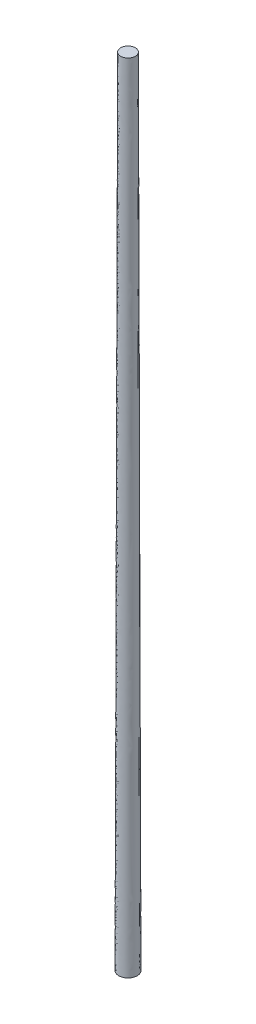
ISO-10303-21;
HEADER;
FILE_DESCRIPTION(('STEP AP214'),'2;1');
FILE_NAME('part.step','',(''),(''),'','','');
FILE_SCHEMA(('AUTOMOTIVE_DESIGN { 1 0 10303 214 1 1 1 1 }'));
ENDSEC;
DATA;
#1=APPLICATION_CONTEXT('core data for automotive mechanical design processes');
#2=APPLICATION_PROTOCOL_DEFINITION('international standard','automotive_design',2000,#1);
#3=PRODUCT_CONTEXT('',#1,'mechanical');
#4=PRODUCT('Part','Part','',(#3));
#5=PRODUCT_RELATED_PRODUCT_CATEGORY('part','',(#4));
#6=PRODUCT_DEFINITION_FORMATION('','',#4);
#7=PRODUCT_DEFINITION_CONTEXT('part definition',#1,'design');
#8=PRODUCT_DEFINITION('design','',#6,#7);
#9=PRODUCT_DEFINITION_SHAPE('','',#8);
#10=(LENGTH_UNIT() NAMED_UNIT(*) SI_UNIT(.MILLI.,.METRE.));
#11=(NAMED_UNIT(*) PLANE_ANGLE_UNIT() SI_UNIT($,.RADIAN.));
#12=(NAMED_UNIT(*) SI_UNIT($,.STERADIAN.) SOLID_ANGLE_UNIT());
#13=UNCERTAINTY_MEASURE_WITH_UNIT(LENGTH_MEASURE(1.E-05),#10,'distance_accuracy_value','');
#14=(GEOMETRIC_REPRESENTATION_CONTEXT(3) GLOBAL_UNCERTAINTY_ASSIGNED_CONTEXT((#13)) GLOBAL_UNIT_ASSIGNED_CONTEXT((#10,
#11,#12)) REPRESENTATION_CONTEXT('',''));
#15=CARTESIAN_POINT('',(0.,0.,0.));
#16=DIRECTION('',(0.,0.,1.));
#17=DIRECTION('',(1.,0.,0.));
#18=AXIS2_PLACEMENT_3D('',#15,#16,#17);
#19=CARTESIAN_POINT('',(0.,0.,0.));
#20=DIRECTION('',(0.,1.,0.));
#21=DIRECTION('',(0.,0.,1.));
#22=AXIS2_PLACEMENT_3D('',#19,#20,#21);
#23=PLANE('',#22);
#24=CARTESIAN_POINT('',(0.,0.,0.));
#25=DIRECTION('',(0.,1.,0.));
#26=DIRECTION('',(0.,0.,1.));
#27=AXIS2_PLACEMENT_3D('',#24,#25,#26);
#28=CIRCLE('',#27,2.5);
#29=CARTESIAN_POINT('',(2.5,0.,0.));
#30=VERTEX_POINT('',#29);
#31=EDGE_CURVE('E12',#30,#30,#28,.T.);
#32=ORIENTED_EDGE('',*,*,#31,.F.);
#33=EDGE_LOOP('',(#32));
#34=FACE_BOUND('',#33,.T.);
#35=ADVANCED_FACE('F63',(#34),#23,.F.);
#36=CARTESIAN_POINT('',(0.,215.9,0.));
#37=DIRECTION('',(0.,1.,0.));
#38=DIRECTION('',(0.,0.,1.));
#39=AXIS2_PLACEMENT_3D('',#36,#37,#38);
#40=PLANE('',#39);
#41=CARTESIAN_POINT('',(0.,215.9,0.));
#42=DIRECTION('',(0.,1.,0.));
#43=DIRECTION('',(0.,0.,1.));
#44=AXIS2_PLACEMENT_3D('',#41,#42,#43);
#45=CIRCLE('',#44,2.);
#46=CARTESIAN_POINT('',(2.,215.9,0.));
#47=VERTEX_POINT('',#46);
#48=EDGE_CURVE('E71',#47,#47,#45,.T.);
#49=ORIENTED_EDGE('',*,*,#48,.T.);
#50=EDGE_LOOP('',(#49));
#51=FACE_BOUND('',#50,.T.);
#52=ADVANCED_FACE('F95',(#51),#40,.T.);
#53=CARTESIAN_POINT('',(2.,215.9,0.));
#54=CARTESIAN_POINT('',(2.16666666666667,143.933333333333,0.));
#55=CARTESIAN_POINT('',(2.33333333333333,71.9666666666667,0.));
#56=CARTESIAN_POINT('',(2.5,0.,0.));
#57=CARTESIAN_POINT('',(2.,215.9,0.0551915009923101));
#58=CARTESIAN_POINT('',(2.16666666666667,143.933333333333,0.0597907927416693));
#59=CARTESIAN_POINT('',(2.33333333333333,71.9666666666667,0.0643900844910285));
#60=CARTESIAN_POINT('',(2.5,0.,0.0689893762403877));
#61=CARTESIAN_POINT('',(1.99551915009923,215.9,0.164536202778468));
#62=CARTESIAN_POINT('',(2.1618124126075,143.933333333333,0.178247553010007));
#63=CARTESIAN_POINT('',(2.32810567511577,71.9666666666667,0.191958903241546));
#64=CARTESIAN_POINT('',(2.49439893762404,0.,0.205670253473085));
#65=CARTESIAN_POINT('',(1.97587170800112,215.9,0.324921972406973));
#66=CARTESIAN_POINT('',(2.14052768366788,143.933333333333,0.351998803440888));
#67=CARTESIAN_POINT('',(2.30518365933464,71.9666666666667,0.379075634474802));
#68=CARTESIAN_POINT('',(2.4698396350014,0.,0.406152465508716));
#69=CARTESIAN_POINT('',(1.94381448111139,215.9,0.4811600765294));
#70=CARTESIAN_POINT('',(2.105799021204,143.933333333333,0.521256749573517));
#71=CARTESIAN_POINT('',(2.26778356129662,71.9666666666667,0.561353422617634));
#72=CARTESIAN_POINT('',(2.42976810138923,0.,0.60145009566175));
#73=CARTESIAN_POINT('',(1.6801107057554,215.9,1.39060441349542));
#74=CARTESIAN_POINT('',(1.82011993123501,143.933333333333,1.50648811462003));
#75=CARTESIAN_POINT('',(1.96012915671463,71.9666666666667,1.62237181574465));
#76=CARTESIAN_POINT('',(2.10013838219425,0.,1.73825551686927));
#77=CARTESIAN_POINT('',(0.883064015876959,215.9,2.));
#78=CARTESIAN_POINT('',(0.956652683866706,143.933333333333,2.16666666666667));
#79=CARTESIAN_POINT('',(1.03024135185645,71.9666666666667,2.33333333333333));
#80=CARTESIAN_POINT('',(1.1038300198462,0.,2.5));
#81=CARTESIAN_POINT('',(-1.1038300198462,215.9,2.));
#82=CARTESIAN_POINT('',(-1.19581585483338,143.933333333333,2.16666666666667));
#83=CARTESIAN_POINT('',(-1.28780168982057,71.9666666666667,2.33333333333333));
#84=CARTESIAN_POINT('',(-1.37978752480775,0.,2.5));
#85=CARTESIAN_POINT('',(-2.,215.9,1.1038300198462));
#86=CARTESIAN_POINT('',(-2.16666666666667,143.933333333333,1.19581585483338));
#87=CARTESIAN_POINT('',(-2.33333333333333,71.9666666666667,1.28780168982057));
#88=CARTESIAN_POINT('',(-2.5,0.,1.37978752480775));
#89=CARTESIAN_POINT('',(-2.,215.9,-1.1038300198462));
#90=CARTESIAN_POINT('',(-2.16666666666667,143.933333333333,-1.19581585483338));
#91=CARTESIAN_POINT('',(-2.33333333333333,71.9666666666667,-1.28780168982057));
#92=CARTESIAN_POINT('',(-2.5,0.,-1.37978752480775));
#93=CARTESIAN_POINT('',(-1.1038300198462,215.9,-2.));
#94=CARTESIAN_POINT('',(-1.19581585483338,143.933333333333,-2.16666666666667));
#95=CARTESIAN_POINT('',(-1.28780168982057,71.9666666666667,-2.33333333333333));
#96=CARTESIAN_POINT('',(-1.37978752480775,0.,-2.5));
#97=CARTESIAN_POINT('',(0.88306401587696,215.9,-2.));
#98=CARTESIAN_POINT('',(0.956652683866707,143.933333333333,-2.16666666666667));
#99=CARTESIAN_POINT('',(1.03024135185645,71.9666666666667,-2.33333333333333));
#100=CARTESIAN_POINT('',(1.1038300198462,0.,-2.5));
#101=CARTESIAN_POINT('',(1.6801107057554,215.9,-1.39060441349542));
#102=CARTESIAN_POINT('',(1.82011993123501,143.933333333333,-1.50648811462003));
#103=CARTESIAN_POINT('',(1.96012915671463,71.9666666666667,-1.62237181574465));
#104=CARTESIAN_POINT('',(2.10013838219425,0.,-1.73825551686927));
#105=CARTESIAN_POINT('',(1.94381448111139,215.9,-0.4811600765294));
#106=CARTESIAN_POINT('',(2.105799021204,143.933333333333,-0.521256749573516));
#107=CARTESIAN_POINT('',(2.26778356129662,71.9666666666667,-0.561353422617633));
#108=CARTESIAN_POINT('',(2.42976810138923,0.,-0.60145009566175));
#109=CARTESIAN_POINT('',(1.97587170800112,215.9,-0.324921972406972));
#110=CARTESIAN_POINT('',(2.14052768366788,143.933333333333,-0.351998803440887));
#111=CARTESIAN_POINT('',(2.30518365933464,71.9666666666667,-0.379075634474801));
#112=CARTESIAN_POINT('',(2.4698396350014,0.,-0.406152465508716));
#113=CARTESIAN_POINT('',(1.99551915009923,215.9,-0.164536202778468));
#114=CARTESIAN_POINT('',(2.1618124126075,143.933333333333,-0.178247553010007));
#115=CARTESIAN_POINT('',(2.32810567511577,71.9666666666667,-0.191958903241546));
#116=CARTESIAN_POINT('',(2.49439893762404,0.,-0.205670253473085));
#117=CARTESIAN_POINT('',(2.,215.9,-0.0551915009923095));
#118=CARTESIAN_POINT('',(2.16666666666667,143.933333333333,-0.0597907927416686));
#119=CARTESIAN_POINT('',(2.33333333333333,71.9666666666667,-0.0643900844910277));
#120=CARTESIAN_POINT('',(2.5,0.,-0.0689893762403868));
#121=CARTESIAN_POINT('',(2.,215.9,0.));
#122=CARTESIAN_POINT('',(2.16666666666667,143.933333333333,0.));
#123=CARTESIAN_POINT('',(2.33333333333333,71.9666666666667,0.));
#124=CARTESIAN_POINT('',(2.5,0.,0.));
#125=B_SPLINE_SURFACE_WITH_KNOTS('',3,3,((#53,#54,#55,#56),(#57,#58,#59,#60),(#61,#62,#63,#64),
(#65,#66,#67,#68),(#69,#70,#71,#72),(#73,#74,#75,#76),(#77,#78,#79,#80),(#81,#82,#83,#84),(#85,
#86,#87,#88),(#89,#90,#91,#92),(#93,#94,#95,#96),(#97,#98,#99,#100),(#101,#102,#103,#104),(#105,
#106,#107,#108),(#109,#110,#111,#112),(#113,#114,#115,#116),(#117,#118,#119,#120),(#121,#122,
#123,#124)),.UNSPECIFIED.,.T.,.F.,.F.,(4,1,1,1,1,2,2,2,1,1,1,1,4),(4,4),(0.,0.0125,
0.0249999999999999,0.0375000000000001,0.05,0.25,0.5,0.75,0.95,0.9625,0.975,0.9875,1.),(0.,1.),.UNSPECIFIED.);
#126=CARTESIAN_POINT('',(2.,215.9,0.));
#127=CARTESIAN_POINT('',(2.00520833333333,213.651041666667,0.));
#128=CARTESIAN_POINT('',(2.01041666666667,211.402083333333,0.));
#129=CARTESIAN_POINT('',(2.02083333333333,206.904166666667,0.));
#130=CARTESIAN_POINT('',(2.02604166666667,204.655208333333,0.));
#131=CARTESIAN_POINT('',(2.03645833333333,200.157291666667,0.));
#132=CARTESIAN_POINT('',(2.04166666666667,197.908333333333,0.));
#133=CARTESIAN_POINT('',(2.05208333333333,193.410416666667,0.));
#134=CARTESIAN_POINT('',(2.05729166666667,191.161458333333,0.));
#135=CARTESIAN_POINT('',(2.06770833333333,186.663541666667,0.));
#136=CARTESIAN_POINT('',(2.07291666666667,184.414583333333,0.));
#137=CARTESIAN_POINT('',(2.08333333333333,179.916666666667,0.));
#138=CARTESIAN_POINT('',(2.08854166666667,177.667708333333,0.));
#139=CARTESIAN_POINT('',(2.09895833333333,173.169791666667,0.));
#140=CARTESIAN_POINT('',(2.10416666666667,170.920833333333,0.));
#141=CARTESIAN_POINT('',(2.11458333333333,166.422916666667,0.));
#142=CARTESIAN_POINT('',(2.11979166666667,164.173958333333,0.));
#143=CARTESIAN_POINT('',(2.13020833333333,159.676041666667,0.));
#144=CARTESIAN_POINT('',(2.13541666666667,157.427083333333,0.));
#145=CARTESIAN_POINT('',(2.14583333333333,152.929166666667,0.));
#146=CARTESIAN_POINT('',(2.15104166666667,150.680208333333,0.));
#147=CARTESIAN_POINT('',(2.16145833333333,146.182291666667,0.));
#148=CARTESIAN_POINT('',(2.16666666666667,143.933333333333,0.));
#149=CARTESIAN_POINT('',(2.17708333333333,139.435416666667,0.));
#150=CARTESIAN_POINT('',(2.18229166666667,137.186458333333,0.));
#151=CARTESIAN_POINT('',(2.19270833333333,132.688541666667,0.));
#152=CARTESIAN_POINT('',(2.19791666666667,130.439583333333,0.));
#153=CARTESIAN_POINT('',(2.20833333333333,125.941666666667,0.));
#154=CARTESIAN_POINT('',(2.21354166666667,123.692708333333,0.));
#155=CARTESIAN_POINT('',(2.22395833333333,119.194791666667,0.));
#156=CARTESIAN_POINT('',(2.22916666666667,116.945833333333,0.));
#157=CARTESIAN_POINT('',(2.23958333333333,112.447916666667,0.));
#158=CARTESIAN_POINT('',(2.24479166666667,110.198958333333,0.));
#159=CARTESIAN_POINT('',(2.25520833333333,105.701041666667,0.));
#160=CARTESIAN_POINT('',(2.26041666666667,103.452083333333,0.));
#161=CARTESIAN_POINT('',(2.27083333333333,98.9541666666667,0.));
#162=CARTESIAN_POINT('',(2.27604166666667,96.7052083333333,0.));
#163=CARTESIAN_POINT('',(2.28645833333333,92.2072916666667,0.));
#164=CARTESIAN_POINT('',(2.29166666666667,89.9583333333333,0.));
#165=CARTESIAN_POINT('',(2.30208333333333,85.4604166666667,0.));
#166=CARTESIAN_POINT('',(2.30729166666667,83.2114583333333,0.));
#167=CARTESIAN_POINT('',(2.31770833333333,78.7135416666667,0.));
#168=CARTESIAN_POINT('',(2.32291666666667,76.4645833333333,0.));
#169=CARTESIAN_POINT('',(2.33333333333333,71.9666666666667,0.));
#170=CARTESIAN_POINT('',(2.33854166666667,69.7177083333333,0.));
#171=CARTESIAN_POINT('',(2.34895833333333,65.2197916666667,0.));
#172=CARTESIAN_POINT('',(2.35416666666667,62.9708333333333,0.));
#173=CARTESIAN_POINT('',(2.36458333333333,58.4729166666667,0.));
#174=CARTESIAN_POINT('',(2.36979166666667,56.2239583333333,0.));
#175=CARTESIAN_POINT('',(2.38020833333333,51.7260416666667,0.));
#176=CARTESIAN_POINT('',(2.38541666666667,49.4770833333333,0.));
#177=CARTESIAN_POINT('',(2.39583333333333,44.9791666666667,0.));
#178=CARTESIAN_POINT('',(2.40104166666667,42.7302083333333,0.));
#179=CARTESIAN_POINT('',(2.41145833333333,38.2322916666667,0.));
#180=CARTESIAN_POINT('',(2.41666666666667,35.9833333333333,0.));
#181=CARTESIAN_POINT('',(2.42708333333333,31.4854166666667,0.));
#182=CARTESIAN_POINT('',(2.43229166666667,29.2364583333333,0.));
#183=CARTESIAN_POINT('',(2.44270833333333,24.7385416666667,0.));
#184=CARTESIAN_POINT('',(2.44791666666667,22.4895833333333,0.));
#185=CARTESIAN_POINT('',(2.45833333333333,17.9916666666667,0.));
#186=CARTESIAN_POINT('',(2.46354166666667,15.7427083333333,0.));
#187=CARTESIAN_POINT('',(2.47395833333333,11.2447916666667,0.));
#188=CARTESIAN_POINT('',(2.47916666666667,8.99583333333334,0.));
#189=CARTESIAN_POINT('',(2.48958333333333,4.49791666666667,0.));
#190=CARTESIAN_POINT('',(2.49479166666667,2.24895833333333,0.));
#191=CARTESIAN_POINT('',(2.5,0.,0.));
#192=B_SPLINE_CURVE_WITH_KNOTS('',3,(#126,#127,#128,#129,#130,#131,#132,#133,#134,#135,#136,
#137,#138,#139,#140,#141,#142,#143,#144,#145,#146,#147,#148,#149,#150,#151,#152,#153,#154,#155,
#156,#157,#158,#159,#160,#161,#162,#163,#164,#165,#166,#167,#168,#169,#170,#171,#172,#173,#174,
#175,#176,#177,#178,#179,#180,#181,#182,#183,#184,#185,#186,#187,#188,#189,#190,#191),
.UNSPECIFIED.,.F.,.F.,(4,2,2,2,2,2,2,2,2,2,2,2,2,2,2,2,2,2,2,2,2,2,2,2,2,2,2,2,2,2,2,2,4),(0.,
6.74689309284285,13.4937861856856,20.2406792785284,26.9875723713713,33.734465464214,
40.4813585570569,47.2282516498997,53.9751447427425,60.7220378355853,67.4689309284281,
74.2158240212709,80.9627171141137,87.7096102069565,94.4565032997993,101.203396392642,
107.950289485485,114.697182578328,121.444075671171,128.190968764013,134.937861856856,
141.684754949699,148.431648042542,155.178541135385,161.925434228227,168.67232732107,
175.419220413913,182.166113506756,188.913006599599,195.659899692441,202.406792785284,
209.153685878127,215.90057897097),.UNSPECIFIED.);
#193=EDGE_CURVE('BSEAM103',#47,#30,#192,.T.);
#194=ORIENTED_EDGE('',*,*,#48,.F.);
#195=ORIENTED_EDGE('',*,*,#31,.T.);
#196=ORIENTED_EDGE('',*,*,#193,.T.);
#197=ORIENTED_EDGE('',*,*,#193,.F.);
#198=EDGE_LOOP('',(#194,#196,#195,#197));
#199=FACE_BOUND('',#198,.T.);
#200=ADVANCED_FACE('F103',(#199),#125,.T.);
#201=CLOSED_SHELL('',(#35,#52,#200));
#202=MANIFOLD_SOLID_BREP('B2',#201);
#203=ADVANCED_BREP_SHAPE_REPRESENTATION('',(#18,#202),#14);
#204=SHAPE_DEFINITION_REPRESENTATION(#9,#203);
ENDSEC;
END-ISO-10303-21;
